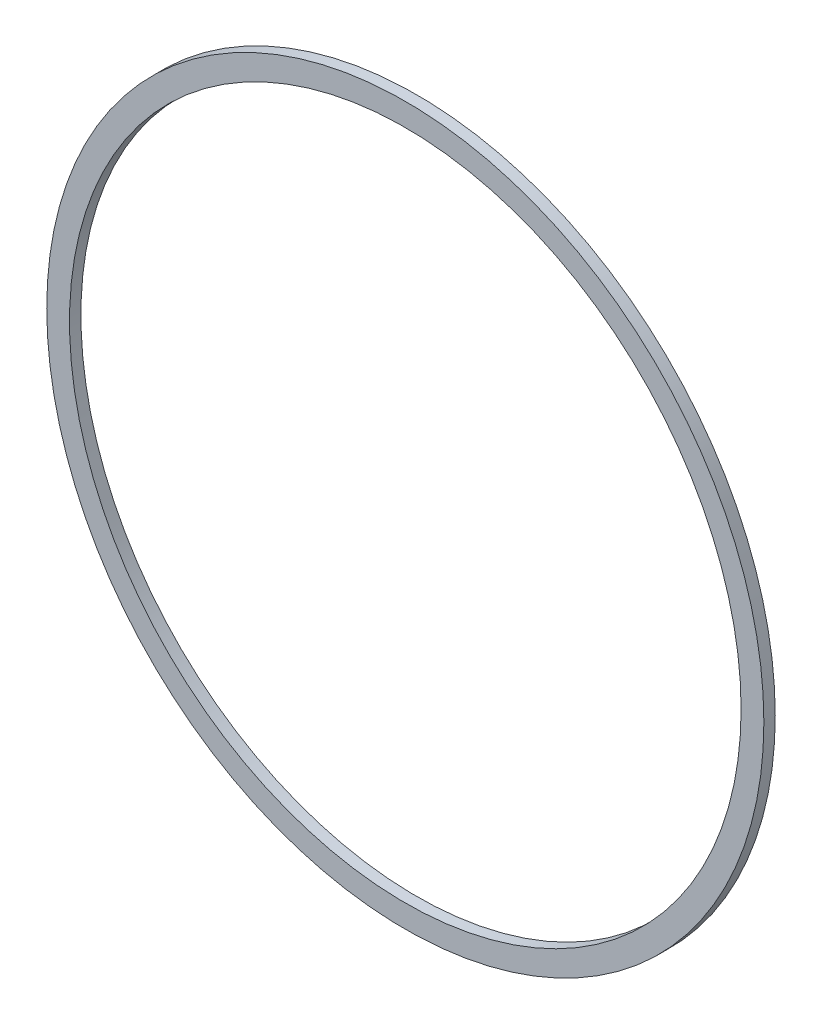
ISO-10303-21;
HEADER;
FILE_DESCRIPTION(('STEP AP214'),'2;1');
FILE_NAME('part.step','',(''),(''),'','','');
FILE_SCHEMA(('AUTOMOTIVE_DESIGN { 1 0 10303 214 1 1 1 1 }'));
ENDSEC;
DATA;
#1=APPLICATION_CONTEXT('core data for automotive mechanical design processes');
#2=APPLICATION_PROTOCOL_DEFINITION('international standard','automotive_design',2000,#1);
#3=PRODUCT_CONTEXT('',#1,'mechanical');
#4=PRODUCT('Part','Part','',(#3));
#5=PRODUCT_RELATED_PRODUCT_CATEGORY('part','',(#4));
#6=PRODUCT_DEFINITION_FORMATION('','',#4);
#7=PRODUCT_DEFINITION_CONTEXT('part definition',#1,'design');
#8=PRODUCT_DEFINITION('design','',#6,#7);
#9=PRODUCT_DEFINITION_SHAPE('','',#8);
#10=(LENGTH_UNIT() NAMED_UNIT(*) SI_UNIT(.MILLI.,.METRE.));
#11=(NAMED_UNIT(*) PLANE_ANGLE_UNIT() SI_UNIT($,.RADIAN.));
#12=(NAMED_UNIT(*) SI_UNIT($,.STERADIAN.) SOLID_ANGLE_UNIT());
#13=UNCERTAINTY_MEASURE_WITH_UNIT(LENGTH_MEASURE(1.E-05),#10,'distance_accuracy_value','');
#14=(GEOMETRIC_REPRESENTATION_CONTEXT(3) GLOBAL_UNCERTAINTY_ASSIGNED_CONTEXT((#13)) GLOBAL_UNIT_ASSIGNED_CONTEXT((#10,
#11,#12)) REPRESENTATION_CONTEXT('',''));
#15=CARTESIAN_POINT('',(0.,0.,0.));
#16=DIRECTION('',(0.,0.,1.));
#17=DIRECTION('',(1.,0.,0.));
#18=AXIS2_PLACEMENT_3D('',#15,#16,#17);
#19=CARTESIAN_POINT('',(0.,0.,0.));
#20=DIRECTION('',(0.,0.,1.));
#21=DIRECTION('',(1.,0.,0.));
#22=AXIS2_PLACEMENT_3D('',#19,#20,#21);
#23=PLANE('',#22);
#24=CARTESIAN_POINT('',(0.,0.,0.));
#25=DIRECTION('',(0.,0.,-1.));
#26=DIRECTION('',(-1.,0.,0.));
#27=AXIS2_PLACEMENT_3D('',#24,#25,#26);
#28=CIRCLE('',#27,59.);
#29=CARTESIAN_POINT('',(59.,0.,0.));
#30=VERTEX_POINT('',#29);
#31=EDGE_CURVE('E54',#30,#30,#28,.T.);
#32=ORIENTED_EDGE('',*,*,#31,.F.);
#33=EDGE_LOOP('',(#32));
#34=FACE_BOUND('',#33,.T.);
#35=CARTESIAN_POINT('',(0.,0.,0.));
#36=DIRECTION('',(0.,0.,1.));
#37=DIRECTION('',(1.,0.,0.));
#38=AXIS2_PLACEMENT_3D('',#35,#36,#37);
#39=CIRCLE('',#38,63.);
#40=CARTESIAN_POINT('',(-63.,0.,0.));
#41=VERTEX_POINT('',#40);
#42=EDGE_CURVE('E11',#41,#41,#39,.T.);
#43=ORIENTED_EDGE('',*,*,#42,.F.);
#44=EDGE_LOOP('',(#43));
#45=FACE_BOUND('',#44,.T.);
#46=ADVANCED_FACE('F17',(#34,#45),#23,.F.);
#47=CARTESIAN_POINT('',(0.,0.,2.));
#48=DIRECTION('',(0.,0.,1.));
#49=DIRECTION('',(1.,0.,0.));
#50=AXIS2_PLACEMENT_3D('',#47,#48,#49);
#51=PLANE('',#50);
#52=CARTESIAN_POINT('',(0.,0.,2.));
#53=DIRECTION('',(0.,0.,-1.));
#54=DIRECTION('',(-1.,0.,0.));
#55=AXIS2_PLACEMENT_3D('',#52,#53,#54);
#56=CIRCLE('',#55,59.);
#57=CARTESIAN_POINT('',(59.,0.,2.));
#58=VERTEX_POINT('',#57);
#59=EDGE_CURVE('E66',#58,#58,#56,.T.);
#60=ORIENTED_EDGE('',*,*,#59,.T.);
#61=EDGE_LOOP('',(#60));
#62=FACE_BOUND('',#61,.T.);
#63=CARTESIAN_POINT('',(0.,0.,2.));
#64=DIRECTION('',(0.,0.,1.));
#65=DIRECTION('',(1.,0.,0.));
#66=AXIS2_PLACEMENT_3D('',#63,#64,#65);
#67=CIRCLE('',#66,63.);
#68=CARTESIAN_POINT('',(-63.,0.,2.));
#69=VERTEX_POINT('',#68);
#70=EDGE_CURVE('E58',#69,#69,#67,.T.);
#71=ORIENTED_EDGE('',*,*,#70,.T.);
#72=EDGE_LOOP('',(#71));
#73=FACE_BOUND('',#72,.T.);
#74=ADVANCED_FACE('F19',(#62,#73),#51,.T.);
#75=CARTESIAN_POINT('',(0.,0.,0.));
#76=DIRECTION('',(0.,0.,1.));
#77=DIRECTION('',(1.,0.,0.));
#78=AXIS2_PLACEMENT_3D('',#75,#76,#77);
#79=CYLINDRICAL_SURFACE('',#78,63.);
#80=ORIENTED_EDGE('',*,*,#70,.F.);
#81=DIRECTION('',(0.,0.,-1.));
#82=VECTOR('',#81,1.);
#83=CARTESIAN_POINT('',(-63.,0.,0.));
#84=LINE('',#83,#82);
#85=EDGE_CURVE('E28',#69,#41,#84,.T.);
#86=ORIENTED_EDGE('',*,*,#85,.T.);
#87=ORIENTED_EDGE('',*,*,#42,.T.);
#88=ORIENTED_EDGE('',*,*,#85,.F.);
#89=EDGE_LOOP('',(#80,#86,#87,#88));
#90=FACE_BOUND('',#89,.T.);
#91=ADVANCED_FACE('F76',(#90),#79,.T.);
#92=CARTESIAN_POINT('',(0.,0.,0.));
#93=DIRECTION('',(0.,0.,1.));
#94=DIRECTION('',(-1.,0.,0.));
#95=AXIS2_PLACEMENT_3D('',#92,#93,#94);
#96=CYLINDRICAL_SURFACE('',#95,59.);
#97=ORIENTED_EDGE('',*,*,#59,.F.);
#98=DIRECTION('',(0.,0.,-1.));
#99=VECTOR('',#98,1.);
#100=CARTESIAN_POINT('',(59.,0.,0.));
#101=LINE('',#100,#99);
#102=EDGE_CURVE('E21',#58,#30,#101,.T.);
#103=ORIENTED_EDGE('',*,*,#102,.T.);
#104=ORIENTED_EDGE('',*,*,#31,.T.);
#105=ORIENTED_EDGE('',*,*,#102,.F.);
#106=EDGE_LOOP('',(#97,#103,#104,#105));
#107=FACE_BOUND('',#106,.T.);
#108=ADVANCED_FACE('F55',(#107),#96,.F.);
#109=CLOSED_SHELL('',(#46,#74,#91,#108));
#110=MANIFOLD_SOLID_BREP('B1',#109);
#111=ADVANCED_BREP_SHAPE_REPRESENTATION('',(#18,#110),#14);
#112=SHAPE_DEFINITION_REPRESENTATION(#9,#111);
ENDSEC;
END-ISO-10303-21;
